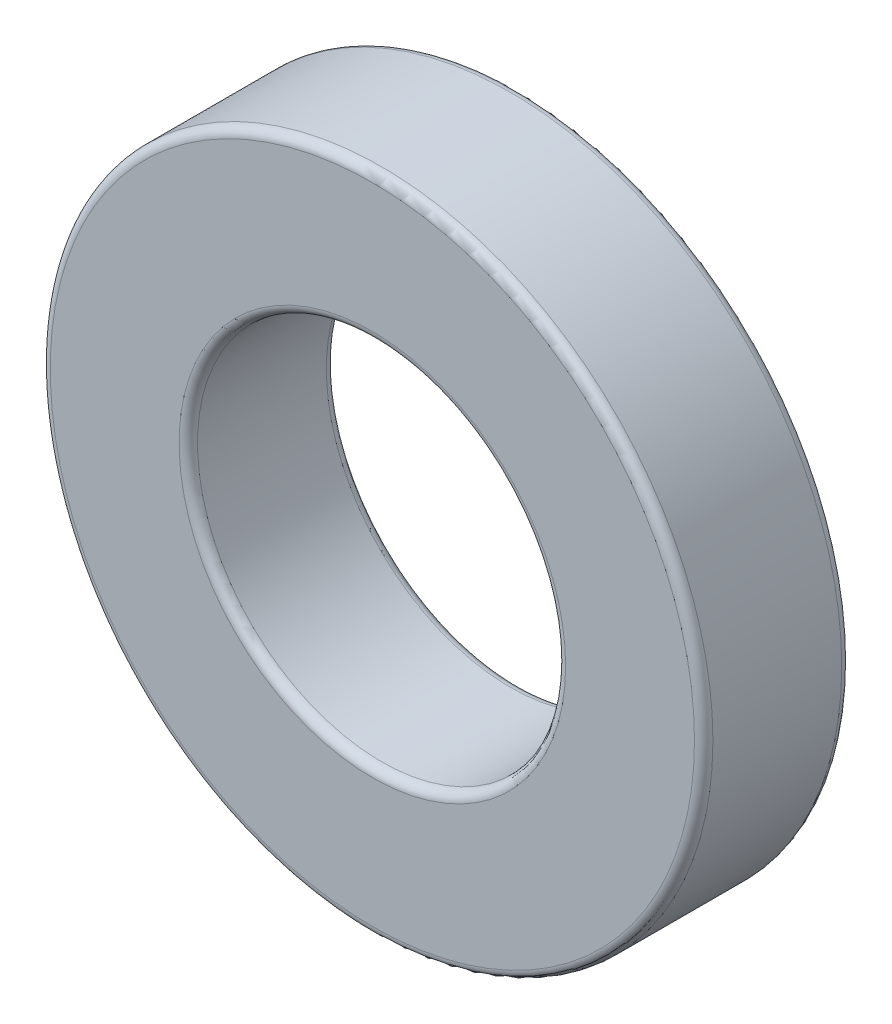
ISO-10303-21;
HEADER;
FILE_DESCRIPTION(('STEP AP214'),'2;1');
FILE_NAME('part.step','',(''),(''),'','','');
FILE_SCHEMA(('AUTOMOTIVE_DESIGN { 1 0 10303 214 1 1 1 1 }'));
ENDSEC;
DATA;
#1=APPLICATION_CONTEXT('core data for automotive mechanical design processes');
#2=APPLICATION_PROTOCOL_DEFINITION('international standard','automotive_design',2000,#1);
#3=PRODUCT_CONTEXT('',#1,'mechanical');
#4=PRODUCT('Part','Part','',(#3));
#5=PRODUCT_RELATED_PRODUCT_CATEGORY('part','',(#4));
#6=PRODUCT_DEFINITION_FORMATION('','',#4);
#7=PRODUCT_DEFINITION_CONTEXT('part definition',#1,'design');
#8=PRODUCT_DEFINITION('design','',#6,#7);
#9=PRODUCT_DEFINITION_SHAPE('','',#8);
#10=(LENGTH_UNIT() NAMED_UNIT(*) SI_UNIT(.MILLI.,.METRE.));
#11=(NAMED_UNIT(*) PLANE_ANGLE_UNIT() SI_UNIT($,.RADIAN.));
#12=(NAMED_UNIT(*) SI_UNIT($,.STERADIAN.) SOLID_ANGLE_UNIT());
#13=UNCERTAINTY_MEASURE_WITH_UNIT(LENGTH_MEASURE(1.E-05),#10,'distance_accuracy_value','');
#14=(GEOMETRIC_REPRESENTATION_CONTEXT(3) GLOBAL_UNCERTAINTY_ASSIGNED_CONTEXT((#13)) GLOBAL_UNIT_ASSIGNED_CONTEXT((#10,
#11,#12)) REPRESENTATION_CONTEXT('',''));
#15=CARTESIAN_POINT('',(0.,0.,0.));
#16=DIRECTION('',(0.,0.,1.));
#17=DIRECTION('',(1.,0.,0.));
#18=AXIS2_PLACEMENT_3D('',#15,#16,#17);
#19=CARTESIAN_POINT('',(0.,0.,8.));
#20=DIRECTION('',(0.,0.,-1.));
#21=DIRECTION('',(-1.,0.,0.));
#22=AXIS2_PLACEMENT_3D('',#19,#20,#21);
#23=CYLINDRICAL_SURFACE('',#22,18.);
#24=CARTESIAN_POINT('',(0.,0.,0.5));
#25=DIRECTION('',(0.,0.,1.));
#26=DIRECTION('',(1.,0.,0.));
#27=AXIS2_PLACEMENT_3D('',#24,#25,#26);
#28=CIRCLE('',#27,18.);
#29=CARTESIAN_POINT('',(18.,0.,0.5));
#30=VERTEX_POINT('',#29);
#31=EDGE_CURVE('E10',#30,#30,#28,.T.);
#32=ORIENTED_EDGE('',*,*,#31,.T.);
#33=EDGE_LOOP('',(#32));
#34=FACE_BOUND('',#33,.T.);
#35=CARTESIAN_POINT('',(0.,0.,7.5));
#36=DIRECTION('',(0.,0.,1.));
#37=DIRECTION('',(1.,0.,0.));
#38=AXIS2_PLACEMENT_3D('',#35,#36,#37);
#39=CIRCLE('',#38,18.);
#40=CARTESIAN_POINT('',(18.,0.,7.5));
#41=VERTEX_POINT('',#40);
#42=EDGE_CURVE('E39',#41,#41,#39,.F.);
#43=ORIENTED_EDGE('',*,*,#42,.T.);
#44=EDGE_LOOP('',(#43));
#45=FACE_BOUND('',#44,.T.);
#46=ADVANCED_FACE('F32',(#34,#45),#23,.T.);
#47=CARTESIAN_POINT('',(0.,0.,8.));
#48=DIRECTION('',(0.,0.,1.));
#49=DIRECTION('',(1.,0.,0.));
#50=AXIS2_PLACEMENT_3D('',#47,#48,#49);
#51=PLANE('',#50);
#52=CARTESIAN_POINT('',(0.,0.,8.));
#53=DIRECTION('',(0.,0.,1.));
#54=DIRECTION('',(1.,0.,0.));
#55=AXIS2_PLACEMENT_3D('',#52,#53,#54);
#56=CIRCLE('',#55,10.5);
#57=CARTESIAN_POINT('',(10.5,0.,8.));
#58=VERTEX_POINT('',#57);
#59=EDGE_CURVE('E52',#58,#58,#56,.F.);
#60=ORIENTED_EDGE('',*,*,#59,.T.);
#61=EDGE_LOOP('',(#60));
#62=FACE_BOUND('',#61,.T.);
#63=CARTESIAN_POINT('',(0.,0.,8.));
#64=DIRECTION('',(0.,0.,1.));
#65=DIRECTION('',(1.,0.,0.));
#66=AXIS2_PLACEMENT_3D('',#63,#64,#65);
#67=CIRCLE('',#66,17.5);
#68=CARTESIAN_POINT('',(17.5,0.,8.));
#69=VERTEX_POINT('',#68);
#70=EDGE_CURVE('E55',#69,#69,#67,.T.);
#71=ORIENTED_EDGE('',*,*,#70,.T.);
#72=EDGE_LOOP('',(#71));
#73=FACE_BOUND('',#72,.T.);
#74=ADVANCED_FACE('F78',(#62,#73),#51,.T.);
#75=CARTESIAN_POINT('',(0.,0.,0.));
#76=DIRECTION('',(0.,0.,1.));
#77=DIRECTION('',(1.,0.,0.));
#78=AXIS2_PLACEMENT_3D('',#75,#76,#77);
#79=PLANE('',#78);
#80=CARTESIAN_POINT('',(0.,0.,0.));
#81=DIRECTION('',(0.,0.,1.));
#82=DIRECTION('',(1.,0.,0.));
#83=AXIS2_PLACEMENT_3D('',#80,#81,#82);
#84=CIRCLE('',#83,10.5);
#85=CARTESIAN_POINT('',(10.5,0.,0.));
#86=VERTEX_POINT('',#85);
#87=EDGE_CURVE('E43',#86,#86,#84,.T.);
#88=ORIENTED_EDGE('',*,*,#87,.T.);
#89=EDGE_LOOP('',(#88));
#90=FACE_BOUND('',#89,.T.);
#91=CARTESIAN_POINT('',(0.,0.,0.));
#92=DIRECTION('',(0.,0.,1.));
#93=DIRECTION('',(1.,0.,0.));
#94=AXIS2_PLACEMENT_3D('',#91,#92,#93);
#95=CIRCLE('',#94,17.5);
#96=CARTESIAN_POINT('',(17.5,0.,0.));
#97=VERTEX_POINT('',#96);
#98=EDGE_CURVE('E47',#97,#97,#95,.F.);
#99=ORIENTED_EDGE('',*,*,#98,.T.);
#100=EDGE_LOOP('',(#99));
#101=FACE_BOUND('',#100,.T.);
#102=ADVANCED_FACE('F75',(#90,#101),#79,.F.);
#103=CARTESIAN_POINT('',(0.,0.,0.));
#104=DIRECTION('',(0.,0.,1.));
#105=DIRECTION('',(1.,0.,0.));
#106=AXIS2_PLACEMENT_3D('',#103,#104,#105);
#107=CYLINDRICAL_SURFACE('',#106,10.);
#108=CARTESIAN_POINT('',(0.,0.,7.5));
#109=DIRECTION('',(0.,0.,1.));
#110=DIRECTION('',(1.,0.,0.));
#111=AXIS2_PLACEMENT_3D('',#108,#109,#110);
#112=CIRCLE('',#111,10.);
#113=CARTESIAN_POINT('',(10.,0.,7.5));
#114=VERTEX_POINT('',#113);
#115=EDGE_CURVE('E58',#114,#114,#112,.T.);
#116=ORIENTED_EDGE('',*,*,#115,.T.);
#117=EDGE_LOOP('',(#116));
#118=FACE_BOUND('',#117,.T.);
#119=CARTESIAN_POINT('',(0.,0.,0.5));
#120=DIRECTION('',(0.,0.,1.));
#121=DIRECTION('',(1.,0.,0.));
#122=AXIS2_PLACEMENT_3D('',#119,#120,#121);
#123=CIRCLE('',#122,10.);
#124=CARTESIAN_POINT('',(10.,0.,0.5));
#125=VERTEX_POINT('',#124);
#126=EDGE_CURVE('E61',#125,#125,#123,.F.);
#127=ORIENTED_EDGE('',*,*,#126,.T.);
#128=EDGE_LOOP('',(#127));
#129=FACE_BOUND('',#128,.T.);
#130=ADVANCED_FACE('F65',(#118,#129),#107,.F.);
#131=CARTESIAN_POINT('',(0.,0.,7.5));
#132=DIRECTION('',(0.,0.,1.));
#133=DIRECTION('',(1.,0.,0.));
#134=AXIS2_PLACEMENT_3D('',#131,#132,#133);
#135=TOROIDAL_SURFACE('',#134,10.5,0.5);
#136=ORIENTED_EDGE('',*,*,#59,.F.);
#137=EDGE_LOOP('',(#136));
#138=FACE_BOUND('',#137,.T.);
#139=ORIENTED_EDGE('',*,*,#115,.F.);
#140=EDGE_LOOP('',(#139));
#141=FACE_BOUND('',#140,.T.);
#142=ADVANCED_FACE('F71',(#138,#141),#135,.T.);
#143=CARTESIAN_POINT('',(0.,0.,0.5));
#144=DIRECTION('',(0.,0.,1.));
#145=DIRECTION('',(1.,0.,0.));
#146=AXIS2_PLACEMENT_3D('',#143,#144,#145);
#147=TOROIDAL_SURFACE('',#146,10.5,0.5);
#148=ORIENTED_EDGE('',*,*,#126,.F.);
#149=EDGE_LOOP('',(#148));
#150=FACE_BOUND('',#149,.T.);
#151=ORIENTED_EDGE('',*,*,#87,.F.);
#152=EDGE_LOOP('',(#151));
#153=FACE_BOUND('',#152,.T.);
#154=ADVANCED_FACE('F67',(#150,#153),#147,.T.);
#155=CARTESIAN_POINT('',(0.,0.,0.5));
#156=DIRECTION('',(0.,0.,1.));
#157=DIRECTION('',(1.,0.,0.));
#158=AXIS2_PLACEMENT_3D('',#155,#156,#157);
#159=TOROIDAL_SURFACE('',#158,17.5,0.5);
#160=ORIENTED_EDGE('',*,*,#98,.F.);
#161=EDGE_LOOP('',(#160));
#162=FACE_BOUND('',#161,.T.);
#163=ORIENTED_EDGE('',*,*,#31,.F.);
#164=EDGE_LOOP('',(#163));
#165=FACE_BOUND('',#164,.T.);
#166=ADVANCED_FACE('F70',(#162,#165),#159,.T.);
#167=CARTESIAN_POINT('',(0.,0.,7.5));
#168=DIRECTION('',(0.,0.,1.));
#169=DIRECTION('',(1.,0.,0.));
#170=AXIS2_PLACEMENT_3D('',#167,#168,#169);
#171=TOROIDAL_SURFACE('',#170,17.5,0.5);
#172=ORIENTED_EDGE('',*,*,#42,.F.);
#173=EDGE_LOOP('',(#172));
#174=FACE_BOUND('',#173,.T.);
#175=ORIENTED_EDGE('',*,*,#70,.F.);
#176=EDGE_LOOP('',(#175));
#177=FACE_BOUND('',#176,.T.);
#178=ADVANCED_FACE('F34',(#174,#177),#171,.T.);
#179=CLOSED_SHELL('',(#46,#74,#102,#130,#142,#154,#166,#178));
#180=MANIFOLD_SOLID_BREP('B2',#179);
#181=ADVANCED_BREP_SHAPE_REPRESENTATION('',(#18,#180),#14);
#182=SHAPE_DEFINITION_REPRESENTATION(#9,#181);
ENDSEC;
END-ISO-10303-21;
